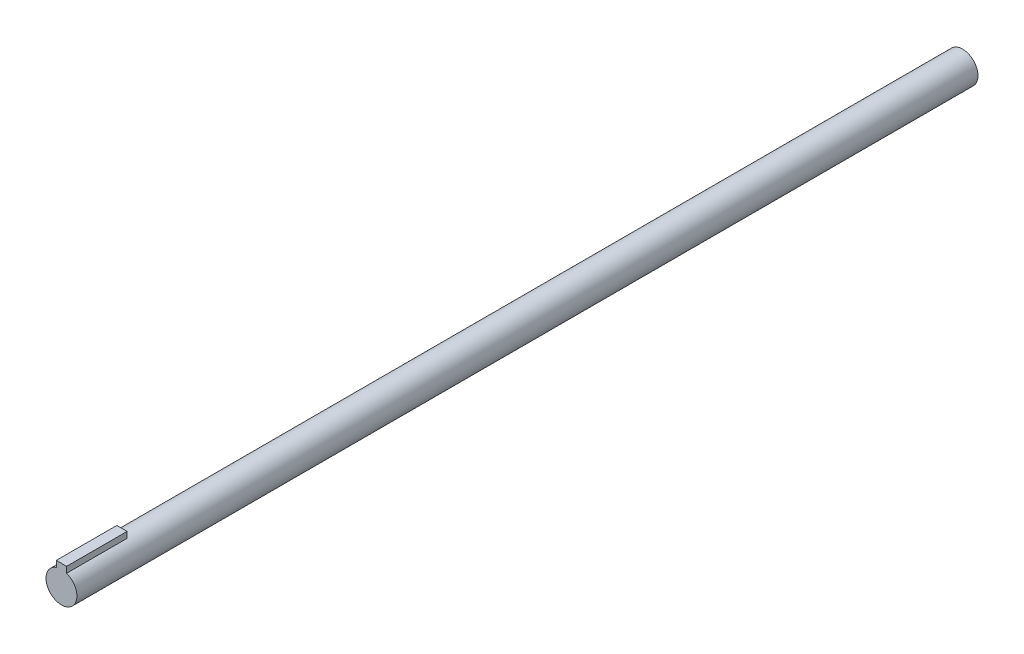
ISO-10303-21;
HEADER;
FILE_DESCRIPTION(('STEP AP214'),'2;1');
FILE_NAME('part.step','',(''),(''),'','','');
FILE_SCHEMA(('AUTOMOTIVE_DESIGN { 1 0 10303 214 1 1 1 1 }'));
ENDSEC;
DATA;
#1=APPLICATION_CONTEXT('core data for automotive mechanical design processes');
#2=APPLICATION_PROTOCOL_DEFINITION('international standard','automotive_design',2000,#1);
#3=PRODUCT_CONTEXT('',#1,'mechanical');
#4=PRODUCT('Part','Part','',(#3));
#5=PRODUCT_RELATED_PRODUCT_CATEGORY('part','',(#4));
#6=PRODUCT_DEFINITION_FORMATION('','',#4);
#7=PRODUCT_DEFINITION_CONTEXT('part definition',#1,'design');
#8=PRODUCT_DEFINITION('design','',#6,#7);
#9=PRODUCT_DEFINITION_SHAPE('','',#8);
#10=(LENGTH_UNIT() NAMED_UNIT(*) SI_UNIT(.MILLI.,.METRE.));
#11=(NAMED_UNIT(*) PLANE_ANGLE_UNIT() SI_UNIT($,.RADIAN.));
#12=(NAMED_UNIT(*) SI_UNIT($,.STERADIAN.) SOLID_ANGLE_UNIT());
#13=UNCERTAINTY_MEASURE_WITH_UNIT(LENGTH_MEASURE(1.E-05),#10,'distance_accuracy_value','');
#14=(GEOMETRIC_REPRESENTATION_CONTEXT(3) GLOBAL_UNCERTAINTY_ASSIGNED_CONTEXT((#13)) GLOBAL_UNIT_ASSIGNED_CONTEXT((#10,
#11,#12)) REPRESENTATION_CONTEXT('',''));
#15=CARTESIAN_POINT('',(0.,0.,0.));
#16=DIRECTION('',(0.,0.,1.));
#17=DIRECTION('',(1.,0.,0.));
#18=AXIS2_PLACEMENT_3D('',#15,#16,#17);
#19=CARTESIAN_POINT('',(0.,0.,350.));
#20=DIRECTION('',(0.,0.,-1.));
#21=DIRECTION('',(-1.,0.,0.));
#22=AXIS2_PLACEMENT_3D('',#19,#20,#21);
#23=CYLINDRICAL_SURFACE('',#22,6.);
#24=CARTESIAN_POINT('',(0.,0.,326.49));
#25=DIRECTION('',(0.,0.,1.));
#26=DIRECTION('',(1.,0.,0.));
#27=AXIS2_PLACEMENT_3D('',#24,#25,#26);
#28=CIRCLE('',#27,6.);
#29=CARTESIAN_POINT('',(2.,5.65685424949238,326.49));
#30=VERTEX_POINT('',#29);
#31=CARTESIAN_POINT('',(-2.,5.65685424949238,326.49));
#32=VERTEX_POINT('',#31);
#33=EDGE_CURVE('E11',#30,#32,#28,.T.);
#34=ORIENTED_EDGE('',*,*,#33,.F.);
#35=DIRECTION('',(0.,0.,-1.));
#36=VECTOR('',#35,1.);
#37=CARTESIAN_POINT('',(2.,5.65685424949238,350.));
#38=LINE('',#37,#36);
#39=CARTESIAN_POINT('',(2.,5.65685424949238,350.));
#40=VERTEX_POINT('',#39);
#41=EDGE_CURVE('E84',#30,#40,#38,.F.);
#42=ORIENTED_EDGE('',*,*,#41,.T.);
#43=CARTESIAN_POINT('',(0.,0.,350.));
#44=DIRECTION('',(0.,0.,1.));
#45=DIRECTION('',(1.,0.,0.));
#46=AXIS2_PLACEMENT_3D('',#43,#44,#45);
#47=CIRCLE('',#46,6.);
#48=CARTESIAN_POINT('',(-2.,5.65685424949238,350.));
#49=VERTEX_POINT('',#48);
#50=EDGE_CURVE('E48',#49,#40,#47,.T.);
#51=ORIENTED_EDGE('',*,*,#50,.F.);
#52=DIRECTION('',(0.,0.,-1.));
#53=VECTOR('',#52,1.);
#54=CARTESIAN_POINT('',(-2.,5.65685424949238,350.));
#55=LINE('',#54,#53);
#56=EDGE_CURVE('E107',#49,#32,#55,.T.);
#57=ORIENTED_EDGE('',*,*,#56,.T.);
#58=EDGE_LOOP('',(#34,#42,#51,#57));
#59=FACE_BOUND('',#58,.T.);
#60=CARTESIAN_POINT('',(0.,0.,0.));
#61=DIRECTION('',(0.,0.,1.));
#62=DIRECTION('',(1.,0.,0.));
#63=AXIS2_PLACEMENT_3D('',#60,#61,#62);
#64=CIRCLE('',#63,6.);
#65=CARTESIAN_POINT('',(6.,0.,0.));
#66=VERTEX_POINT('',#65);
#67=EDGE_CURVE('E115',#66,#66,#64,.T.);
#68=ORIENTED_EDGE('',*,*,#67,.T.);
#69=EDGE_LOOP('',(#68));
#70=FACE_BOUND('',#69,.T.);
#71=ADVANCED_FACE('F41',(#59,#70),#23,.T.);
#72=CARTESIAN_POINT('',(0.,0.,350.));
#73=DIRECTION('',(0.,0.,1.));
#74=DIRECTION('',(1.,0.,0.));
#75=AXIS2_PLACEMENT_3D('',#72,#73,#74);
#76=PLANE('',#75);
#77=ORIENTED_EDGE('',*,*,#50,.T.);
#78=DIRECTION('',(0.,1.,0.));
#79=VECTOR('',#78,1.);
#80=CARTESIAN_POINT('',(2.,8.,350.));
#81=LINE('',#80,#79);
#82=CARTESIAN_POINT('',(2.,8.,350.));
#83=VERTEX_POINT('',#82);
#84=EDGE_CURVE('E103',#40,#83,#81,.T.);
#85=ORIENTED_EDGE('',*,*,#84,.T.);
#86=DIRECTION('',(-1.,0.,0.));
#87=VECTOR('',#86,1.);
#88=CARTESIAN_POINT('',(-2.,8.,350.));
#89=LINE('',#88,#87);
#90=CARTESIAN_POINT('',(-2.,8.,350.));
#91=VERTEX_POINT('',#90);
#92=EDGE_CURVE('E91',#83,#91,#89,.T.);
#93=ORIENTED_EDGE('',*,*,#92,.T.);
#94=DIRECTION('',(0.,-1.,0.));
#95=VECTOR('',#94,1.);
#96=CARTESIAN_POINT('',(-2.,8.,350.));
#97=LINE('',#96,#95);
#98=EDGE_CURVE('E87',#91,#49,#97,.T.);
#99=ORIENTED_EDGE('',*,*,#98,.T.);
#100=EDGE_LOOP('',(#77,#85,#93,#99));
#101=FACE_BOUND('',#100,.T.);
#102=ADVANCED_FACE('F120',(#101),#76,.T.);
#103=CARTESIAN_POINT('',(0.,0.,0.));
#104=DIRECTION('',(0.,0.,1.));
#105=DIRECTION('',(1.,0.,0.));
#106=AXIS2_PLACEMENT_3D('',#103,#104,#105);
#107=PLANE('',#106);
#108=ORIENTED_EDGE('',*,*,#67,.F.);
#109=EDGE_LOOP('',(#108));
#110=FACE_BOUND('',#109,.T.);
#111=ADVANCED_FACE('F119',(#110),#107,.F.);
#112=CARTESIAN_POINT('',(2.,8.,326.49));
#113=DIRECTION('',(1.,0.,0.));
#114=DIRECTION('',(0.,1.,0.));
#115=AXIS2_PLACEMENT_3D('',#112,#113,#114);
#116=PLANE('',#115);
#117=ORIENTED_EDGE('',*,*,#41,.F.);
#118=DIRECTION('',(0.,1.,0.));
#119=VECTOR('',#118,1.);
#120=CARTESIAN_POINT('',(2.,8.,326.49));
#121=LINE('',#120,#119);
#122=CARTESIAN_POINT('',(2.,8.,326.49));
#123=VERTEX_POINT('',#122);
#124=EDGE_CURVE('E79',#30,#123,#121,.T.);
#125=ORIENTED_EDGE('',*,*,#124,.T.);
#126=DIRECTION('',(0.,0.,1.));
#127=VECTOR('',#126,1.);
#128=CARTESIAN_POINT('',(2.,8.,326.49));
#129=LINE('',#128,#127);
#130=EDGE_CURVE('E81',#123,#83,#129,.T.);
#131=ORIENTED_EDGE('',*,*,#130,.T.);
#132=ORIENTED_EDGE('',*,*,#84,.F.);
#133=EDGE_LOOP('',(#117,#125,#131,#132));
#134=FACE_BOUND('',#133,.T.);
#135=ADVANCED_FACE('F80',(#134),#116,.T.);
#136=CARTESIAN_POINT('',(-2.,8.,326.49));
#137=DIRECTION('',(-1.,0.,0.));
#138=DIRECTION('',(0.,-1.,0.));
#139=AXIS2_PLACEMENT_3D('',#136,#137,#138);
#140=PLANE('',#139);
#141=ORIENTED_EDGE('',*,*,#56,.F.);
#142=ORIENTED_EDGE('',*,*,#98,.F.);
#143=DIRECTION('',(0.,0.,1.));
#144=VECTOR('',#143,1.);
#145=CARTESIAN_POINT('',(-2.,8.,326.49));
#146=LINE('',#145,#144);
#147=CARTESIAN_POINT('',(-2.,8.,326.49));
#148=VERTEX_POINT('',#147);
#149=EDGE_CURVE('E94',#148,#91,#146,.T.);
#150=ORIENTED_EDGE('',*,*,#149,.F.);
#151=DIRECTION('',(0.,-1.,0.));
#152=VECTOR('',#151,1.);
#153=CARTESIAN_POINT('',(-2.,8.,326.49));
#154=LINE('',#153,#152);
#155=EDGE_CURVE('E92',#148,#32,#154,.T.);
#156=ORIENTED_EDGE('',*,*,#155,.T.);
#157=EDGE_LOOP('',(#141,#142,#150,#156));
#158=FACE_BOUND('',#157,.T.);
#159=ADVANCED_FACE('F123',(#158),#140,.T.);
#160=CARTESIAN_POINT('',(-2.,8.,326.49));
#161=DIRECTION('',(0.,1.,0.));
#162=DIRECTION('',(0.,0.,1.));
#163=AXIS2_PLACEMENT_3D('',#160,#161,#162);
#164=PLANE('',#163);
#165=ORIENTED_EDGE('',*,*,#92,.F.);
#166=ORIENTED_EDGE('',*,*,#130,.F.);
#167=DIRECTION('',(-1.,0.,0.));
#168=VECTOR('',#167,1.);
#169=CARTESIAN_POINT('',(-2.,8.,326.49));
#170=LINE('',#169,#168);
#171=EDGE_CURVE('E88',#123,#148,#170,.T.);
#172=ORIENTED_EDGE('',*,*,#171,.T.);
#173=ORIENTED_EDGE('',*,*,#149,.T.);
#174=EDGE_LOOP('',(#165,#166,#172,#173));
#175=FACE_BOUND('',#174,.T.);
#176=ADVANCED_FACE('F93',(#175),#164,.T.);
#177=CARTESIAN_POINT('',(0.,0.,326.49));
#178=DIRECTION('',(0.,0.,1.));
#179=DIRECTION('',(1.,0.,0.));
#180=AXIS2_PLACEMENT_3D('',#177,#178,#179);
#181=PLANE('',#180);
#182=ORIENTED_EDGE('',*,*,#124,.F.);
#183=ORIENTED_EDGE('',*,*,#33,.T.);
#184=ORIENTED_EDGE('',*,*,#155,.F.);
#185=ORIENTED_EDGE('',*,*,#171,.F.);
#186=EDGE_LOOP('',(#182,#183,#184,#185));
#187=FACE_BOUND('',#186,.T.);
#188=ADVANCED_FACE('F98',(#187),#181,.F.);
#189=CLOSED_SHELL('',(#71,#102,#111,#135,#159,#176,#188));
#190=MANIFOLD_SOLID_BREP('B2',#189);
#191=ADVANCED_BREP_SHAPE_REPRESENTATION('',(#18,#190),#14);
#192=SHAPE_DEFINITION_REPRESENTATION(#9,#191);
ENDSEC;
END-ISO-10303-21;
